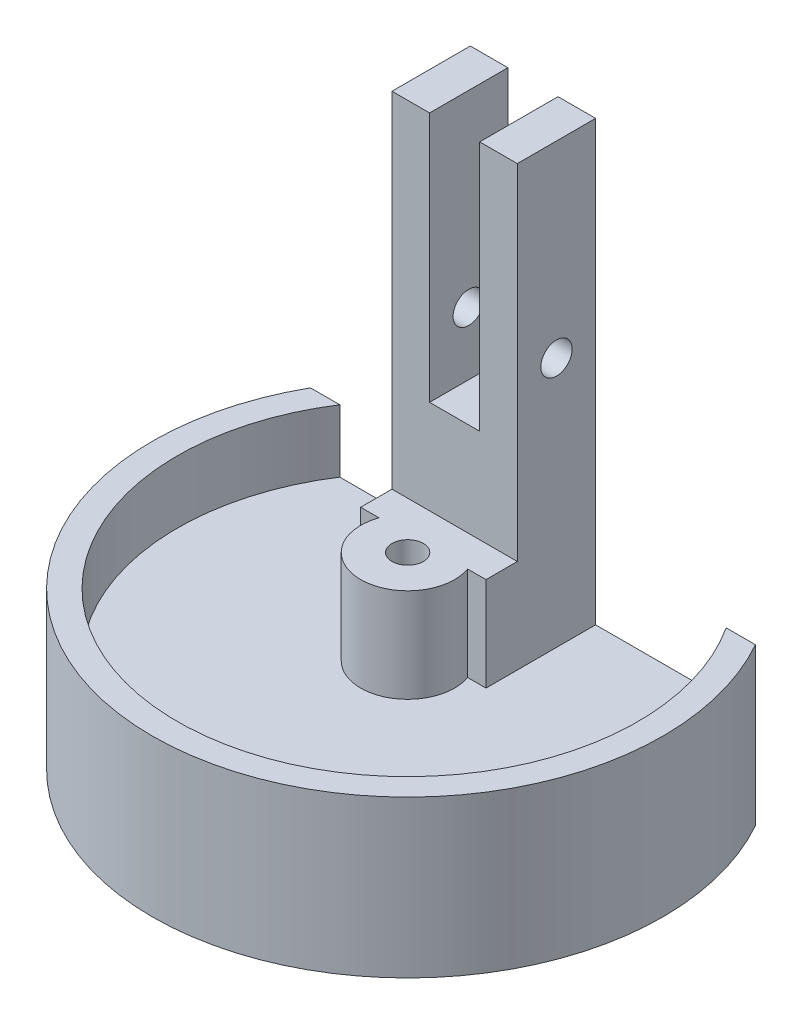
ISO-10303-21;
HEADER;
FILE_DESCRIPTION(('STEP AP214'),'2;1');
FILE_NAME('part.step','',(''),(''),'','','');
FILE_SCHEMA(('AUTOMOTIVE_DESIGN { 1 0 10303 214 1 1 1 1 }'));
ENDSEC;
DATA;
#1=APPLICATION_CONTEXT('core data for automotive mechanical design processes');
#2=APPLICATION_PROTOCOL_DEFINITION('international standard','automotive_design',2000,#1);
#3=PRODUCT_CONTEXT('',#1,'mechanical');
#4=PRODUCT('Part','Part','',(#3));
#5=PRODUCT_RELATED_PRODUCT_CATEGORY('part','',(#4));
#6=PRODUCT_DEFINITION_FORMATION('','',#4);
#7=PRODUCT_DEFINITION_CONTEXT('part definition',#1,'design');
#8=PRODUCT_DEFINITION('design','',#6,#7);
#9=PRODUCT_DEFINITION_SHAPE('','',#8);
#10=(LENGTH_UNIT() NAMED_UNIT(*) SI_UNIT(.MILLI.,.METRE.));
#11=(NAMED_UNIT(*) PLANE_ANGLE_UNIT() SI_UNIT($,.RADIAN.));
#12=(NAMED_UNIT(*) SI_UNIT($,.STERADIAN.) SOLID_ANGLE_UNIT());
#13=UNCERTAINTY_MEASURE_WITH_UNIT(LENGTH_MEASURE(1.E-05),#10,'distance_accuracy_value','');
#14=(GEOMETRIC_REPRESENTATION_CONTEXT(3) GLOBAL_UNCERTAINTY_ASSIGNED_CONTEXT((#13)) GLOBAL_UNIT_ASSIGNED_CONTEXT((#10,
#11,#12)) REPRESENTATION_CONTEXT('',''));
#15=CARTESIAN_POINT('',(0.,0.,0.));
#16=DIRECTION('',(0.,0.,1.));
#17=DIRECTION('',(1.,0.,0.));
#18=AXIS2_PLACEMENT_3D('',#15,#16,#17);
#19=CARTESIAN_POINT('',(-10.,75.,-2.5));
#20=DIRECTION('',(0.,0.,-1.));
#21=DIRECTION('',(-1.,0.,0.));
#22=AXIS2_PLACEMENT_3D('',#19,#20,#21);
#23=PLANE('',#22);
#24=DIRECTION('',(-1.,0.,0.));
#25=VECTOR('',#24,1.);
#26=CARTESIAN_POINT('',(-10.,20.,-2.5));
#27=LINE('',#26,#25);
#28=CARTESIAN_POINT('',(-7.07106781186547,20.,-2.5));
#29=VERTEX_POINT('',#28);
#30=CARTESIAN_POINT('',(-10.,20.,-2.5));
#31=VERTEX_POINT('',#30);
#32=EDGE_CURVE('E326',#29,#31,#27,.T.);
#33=ORIENTED_EDGE('',*,*,#32,.T.);
#34=DIRECTION('',(0.,-1.,0.));
#35=VECTOR('',#34,1.);
#36=CARTESIAN_POINT('',(-10.,75.,-2.5));
#37=LINE('',#36,#35);
#38=CARTESIAN_POINT('',(-10.,5.,-2.5));
#39=VERTEX_POINT('',#38);
#40=EDGE_CURVE('E54',#31,#39,#37,.T.);
#41=ORIENTED_EDGE('',*,*,#40,.T.);
#42=DIRECTION('',(1.,0.,0.));
#43=VECTOR('',#42,1.);
#44=CARTESIAN_POINT('',(-10.,5.,-2.5));
#45=LINE('',#44,#43);
#46=CARTESIAN_POINT('',(-7.07106781186547,5.,-2.5));
#47=VERTEX_POINT('',#46);
#48=EDGE_CURVE('E198',#39,#47,#45,.T.);
#49=ORIENTED_EDGE('',*,*,#48,.T.);
#50=DIRECTION('',(0.,-1.,0.));
#51=VECTOR('',#50,1.);
#52=CARTESIAN_POINT('',(-7.07106781186548,20.,-2.5));
#53=LINE('',#52,#51);
#54=EDGE_CURVE('E207',#47,#29,#53,.F.);
#55=ORIENTED_EDGE('',*,*,#54,.T.);
#56=EDGE_LOOP('',(#33,#41,#49,#55));
#57=FACE_BOUND('',#56,.T.);
#58=ADVANCED_FACE('F32',(#57),#23,.F.);
#59=CARTESIAN_POINT('',(10.,20.,-2.5));
#60=VERTEX_POINT('',#59);
#61=CARTESIAN_POINT('',(7.07106781186547,20.,-2.5));
#62=VERTEX_POINT('',#61);
#63=EDGE_CURVE('E323',#60,#62,#27,.T.);
#64=ORIENTED_EDGE('',*,*,#63,.T.);
#65=DIRECTION('',(0.,-1.,0.));
#66=VECTOR('',#65,1.);
#67=CARTESIAN_POINT('',(7.07106781186547,20.,-2.5));
#68=LINE('',#67,#66);
#69=CARTESIAN_POINT('',(7.07106781186547,5.,-2.5));
#70=VERTEX_POINT('',#69);
#71=EDGE_CURVE('E210',#62,#70,#68,.T.);
#72=ORIENTED_EDGE('',*,*,#71,.T.);
#73=CARTESIAN_POINT('',(10.,5.,-2.5));
#74=VERTEX_POINT('',#73);
#75=EDGE_CURVE('E196',#70,#74,#45,.T.);
#76=ORIENTED_EDGE('',*,*,#75,.T.);
#77=DIRECTION('',(0.,-1.,0.));
#78=VECTOR('',#77,1.);
#79=CARTESIAN_POINT('',(10.,75.,-2.5));
#80=LINE('',#79,#78);
#81=EDGE_CURVE('E204',#60,#74,#80,.T.);
#82=ORIENTED_EDGE('',*,*,#81,.F.);
#83=EDGE_LOOP('',(#64,#72,#76,#82));
#84=FACE_BOUND('',#83,.T.);
#85=ADVANCED_FACE('F341',(#84),#23,.F.);
#86=CARTESIAN_POINT('',(-10.,75.,-20.));
#87=DIRECTION('',(0.,-1.,0.));
#88=DIRECTION('',(0.,0.,-1.));
#89=AXIS2_PLACEMENT_3D('',#86,#87,#88);
#90=PLANE('',#89);
#91=DIRECTION('',(0.,0.,1.));
#92=VECTOR('',#91,1.);
#93=CARTESIAN_POINT('',(-10.,75.,-2.5));
#94=LINE('',#93,#92);
#95=CARTESIAN_POINT('',(-10.,75.,-20.));
#96=VERTEX_POINT('',#95);
#97=CARTESIAN_POINT('',(-10.,75.,-7.5));
#98=VERTEX_POINT('',#97);
#99=EDGE_CURVE('E183',#96,#98,#94,.T.);
#100=ORIENTED_EDGE('',*,*,#99,.T.);
#101=DIRECTION('',(-1.,0.,0.));
#102=VECTOR('',#101,1.);
#103=CARTESIAN_POINT('',(-10.,75.,-7.5));
#104=LINE('',#103,#102);
#105=CARTESIAN_POINT('',(-4.,75.,-7.5));
#106=VERTEX_POINT('',#105);
#107=EDGE_CURVE('E175',#106,#98,#104,.T.);
#108=ORIENTED_EDGE('',*,*,#107,.F.);
#109=DIRECTION('',(0.,0.,1.));
#110=VECTOR('',#109,1.);
#111=CARTESIAN_POINT('',(-4.,75.,-20.));
#112=LINE('',#111,#110);
#113=CARTESIAN_POINT('',(-4.,75.,-20.));
#114=VERTEX_POINT('',#113);
#115=EDGE_CURVE('E300',#114,#106,#112,.T.);
#116=ORIENTED_EDGE('',*,*,#115,.F.);
#117=DIRECTION('',(-1.,0.,0.));
#118=VECTOR('',#117,1.);
#119=CARTESIAN_POINT('',(-10.,75.,-20.));
#120=LINE('',#119,#118);
#121=EDGE_CURVE('E182',#114,#96,#120,.T.);
#122=ORIENTED_EDGE('',*,*,#121,.T.);
#123=EDGE_LOOP('',(#100,#108,#116,#122));
#124=FACE_BOUND('',#123,.T.);
#125=ADVANCED_FACE('F376',(#124),#90,.F.);
#126=CARTESIAN_POINT('',(0.,5.,0.));
#127=DIRECTION('',(0.,1.,0.));
#128=DIRECTION('',(0.,0.,1.));
#129=AXIS2_PLACEMENT_3D('',#126,#127,#128);
#130=PLANE('',#129);
#131=DIRECTION('',(1.,0.,0.));
#132=VECTOR('',#131,1.);
#133=CARTESIAN_POINT('',(-35.5044011356339,5.,-20.));
#134=LINE('',#133,#132);
#135=CARTESIAN_POINT('',(-30.8311936194498,5.,-20.));
#136=VERTEX_POINT('',#135);
#137=CARTESIAN_POINT('',(-10.,5.,-20.));
#138=VERTEX_POINT('',#137);
#139=EDGE_CURVE('E263',#136,#138,#134,.T.);
#140=ORIENTED_EDGE('',*,*,#139,.F.);
#141=CARTESIAN_POINT('',(0.,5.,0.));
#142=DIRECTION('',(0.,1.,0.));
#143=DIRECTION('',(0.,0.,1.));
#144=AXIS2_PLACEMENT_3D('',#141,#142,#143);
#145=CIRCLE('',#144,36.75);
#146=CARTESIAN_POINT('',(30.8311936194498,5.,-20.));
#147=VERTEX_POINT('',#146);
#148=EDGE_CURVE('E225',#136,#147,#145,.T.);
#149=ORIENTED_EDGE('',*,*,#148,.T.);
#150=CARTESIAN_POINT('',(9.99999999999999,5.,-20.));
#151=VERTEX_POINT('',#150);
#152=EDGE_CURVE('E260',#151,#147,#134,.T.);
#153=ORIENTED_EDGE('',*,*,#152,.F.);
#154=DIRECTION('',(0.,0.,-1.));
#155=VECTOR('',#154,1.);
#156=CARTESIAN_POINT('',(10.,5.,-2.5));
#157=LINE('',#156,#155);
#158=EDGE_CURVE('E188',#74,#151,#157,.T.);
#159=ORIENTED_EDGE('',*,*,#158,.F.);
#160=ORIENTED_EDGE('',*,*,#75,.F.);
#161=CARTESIAN_POINT('',(0.,5.,0.));
#162=DIRECTION('',(0.,1.,0.));
#163=DIRECTION('',(0.,0.,1.));
#164=AXIS2_PLACEMENT_3D('',#161,#162,#163);
#165=CIRCLE('',#164,7.5);
#166=EDGE_CURVE('E226',#47,#70,#165,.T.);
#167=ORIENTED_EDGE('',*,*,#166,.F.);
#168=ORIENTED_EDGE('',*,*,#48,.F.);
#169=DIRECTION('',(0.,0.,1.));
#170=VECTOR('',#169,1.);
#171=CARTESIAN_POINT('',(-10.,5.,-2.5));
#172=LINE('',#171,#170);
#173=EDGE_CURVE('E193',#138,#39,#172,.T.);
#174=ORIENTED_EDGE('',*,*,#173,.F.);
#175=EDGE_LOOP('',(#140,#149,#153,#159,#160,#167,#168,#174));
#176=FACE_BOUND('',#175,.T.);
#177=ADVANCED_FACE('F346',(#176),#130,.T.);
#178=CARTESIAN_POINT('',(0.,20.,0.));
#179=DIRECTION('',(0.,1.,0.));
#180=DIRECTION('',(0.,0.,1.));
#181=AXIS2_PLACEMENT_3D('',#178,#179,#180);
#182=PLANE('',#181);
#183=ORIENTED_EDGE('',*,*,#32,.F.);
#184=CARTESIAN_POINT('',(0.,20.,0.));
#185=DIRECTION('',(0.,1.,0.));
#186=DIRECTION('',(0.,0.,1.));
#187=AXIS2_PLACEMENT_3D('',#184,#185,#186);
#188=CIRCLE('',#187,7.5);
#189=EDGE_CURVE('E233',#29,#62,#188,.T.);
#190=ORIENTED_EDGE('',*,*,#189,.T.);
#191=ORIENTED_EDGE('',*,*,#63,.F.);
#192=DIRECTION('',(0.,0.,1.));
#193=VECTOR('',#192,1.);
#194=CARTESIAN_POINT('',(10.,20.,-2.5));
#195=LINE('',#194,#193);
#196=CARTESIAN_POINT('',(10.,20.,-7.5));
#197=VERTEX_POINT('',#196);
#198=EDGE_CURVE('E330',#197,#60,#195,.T.);
#199=ORIENTED_EDGE('',*,*,#198,.F.);
#200=DIRECTION('',(1.,0.,0.));
#201=VECTOR('',#200,1.);
#202=CARTESIAN_POINT('',(-10.,20.,-7.5));
#203=LINE('',#202,#201);
#204=CARTESIAN_POINT('',(-10.,20.,-7.5));
#205=VERTEX_POINT('',#204);
#206=EDGE_CURVE('E161',#205,#197,#203,.T.);
#207=ORIENTED_EDGE('',*,*,#206,.F.);
#208=DIRECTION('',(0.,0.,-1.));
#209=VECTOR('',#208,1.);
#210=CARTESIAN_POINT('',(-10.,20.,-2.5));
#211=LINE('',#210,#209);
#212=EDGE_CURVE('E332',#31,#205,#211,.T.);
#213=ORIENTED_EDGE('',*,*,#212,.F.);
#214=EDGE_LOOP('',(#183,#190,#191,#199,#207,#213));
#215=FACE_BOUND('',#214,.T.);
#216=CARTESIAN_POINT('',(0.,20.,0.));
#217=DIRECTION('',(0.,1.,0.));
#218=DIRECTION('',(0.,0.,1.));
#219=AXIS2_PLACEMENT_3D('',#216,#217,#218);
#220=CIRCLE('',#219,2.5);
#221=CARTESIAN_POINT('',(0.,20.,2.5));
#222=VERTEX_POINT('',#221);
#223=EDGE_CURVE('E230',#222,#222,#220,.T.);
#224=ORIENTED_EDGE('',*,*,#223,.F.);
#225=EDGE_LOOP('',(#224));
#226=FACE_BOUND('',#225,.T.);
#227=ADVANCED_FACE('F404',(#215,#226),#182,.T.);
#228=CARTESIAN_POINT('',(0.,20.,0.));
#229=DIRECTION('',(0.,-1.,0.));
#230=DIRECTION('',(0.,0.,-1.));
#231=AXIS2_PLACEMENT_3D('',#228,#229,#230);
#232=CYLINDRICAL_SURFACE('',#231,7.5);
#233=ORIENTED_EDGE('',*,*,#71,.F.);
#234=ORIENTED_EDGE('',*,*,#189,.F.);
#235=ORIENTED_EDGE('',*,*,#54,.F.);
#236=ORIENTED_EDGE('',*,*,#166,.T.);
#237=EDGE_LOOP('',(#233,#234,#235,#236));
#238=FACE_BOUND('',#237,.T.);
#239=ADVANCED_FACE('F34',(#238),#232,.T.);
#240=CARTESIAN_POINT('',(0.,0.,0.));
#241=DIRECTION('',(0.,1.,0.));
#242=DIRECTION('',(0.,0.,1.));
#243=AXIS2_PLACEMENT_3D('',#240,#241,#242);
#244=PLANE('',#243);
#245=CARTESIAN_POINT('',(0.,0.,0.));
#246=DIRECTION('',(0.,1.,0.));
#247=DIRECTION('',(0.,0.,1.));
#248=AXIS2_PLACEMENT_3D('',#245,#246,#247);
#249=CIRCLE('',#248,2.5);
#250=CARTESIAN_POINT('',(0.,0.,2.5));
#251=VERTEX_POINT('',#250);
#252=EDGE_CURVE('E229',#251,#251,#249,.T.);
#253=ORIENTED_EDGE('',*,*,#252,.T.);
#254=EDGE_LOOP('',(#253));
#255=FACE_BOUND('',#254,.T.);
#256=CARTESIAN_POINT('',(0.,0.,0.));
#257=DIRECTION('',(0.,1.,0.));
#258=DIRECTION('',(0.,0.,1.));
#259=AXIS2_PLACEMENT_3D('',#256,#257,#258);
#260=CIRCLE('',#259,36.75);
#261=CARTESIAN_POINT('',(-30.8311936194498,0.,-20.));
#262=VERTEX_POINT('',#261);
#263=CARTESIAN_POINT('',(30.8311936194498,0.,-20.));
#264=VERTEX_POINT('',#263);
#265=EDGE_CURVE('E40',#262,#264,#260,.T.);
#266=ORIENTED_EDGE('',*,*,#265,.F.);
#267=DIRECTION('',(1.,0.,0.));
#268=VECTOR('',#267,1.);
#269=CARTESIAN_POINT('',(-35.5044011356339,0.,-20.));
#270=LINE('',#269,#268);
#271=EDGE_CURVE('E258',#262,#264,#270,.T.);
#272=ORIENTED_EDGE('',*,*,#271,.T.);
#273=EDGE_LOOP('',(#266,#272));
#274=FACE_BOUND('',#273,.T.);
#275=ADVANCED_FACE('F257',(#255,#274),#244,.F.);
#276=CARTESIAN_POINT('',(0.,20.,0.));
#277=DIRECTION('',(0.,-1.,0.));
#278=DIRECTION('',(0.,0.,-1.));
#279=AXIS2_PLACEMENT_3D('',#276,#277,#278);
#280=CYLINDRICAL_SURFACE('',#279,2.5);
#281=ORIENTED_EDGE('',*,*,#223,.T.);
#282=EDGE_LOOP('',(#281));
#283=FACE_BOUND('',#282,.T.);
#284=ORIENTED_EDGE('',*,*,#252,.F.);
#285=EDGE_LOOP('',(#284));
#286=FACE_BOUND('',#285,.T.);
#287=ADVANCED_FACE('F365',(#283,#286),#280,.F.);
#288=CARTESIAN_POINT('',(0.,15.,0.));
#289=DIRECTION('',(0.,1.,0.));
#290=DIRECTION('',(0.,0.,1.));
#291=AXIS2_PLACEMENT_3D('',#288,#289,#290);
#292=PLANE('',#291);
#293=DIRECTION('',(1.,0.,0.));
#294=VECTOR('',#293,1.);
#295=CARTESIAN_POINT('',(-35.5044011356339,15.,-20.));
#296=LINE('',#295,#294);
#297=CARTESIAN_POINT('',(-35.5044011356339,15.,-20.));
#298=VERTEX_POINT('',#297);
#299=CARTESIAN_POINT('',(-30.8311936194498,15.,-20.));
#300=VERTEX_POINT('',#299);
#301=EDGE_CURVE('E261',#298,#300,#296,.T.);
#302=ORIENTED_EDGE('',*,*,#301,.F.);
#303=CARTESIAN_POINT('',(0.,15.,0.));
#304=DIRECTION('',(0.,1.,0.));
#305=DIRECTION('',(0.,0.,1.));
#306=AXIS2_PLACEMENT_3D('',#303,#304,#305);
#307=CIRCLE('',#306,40.75);
#308=CARTESIAN_POINT('',(35.5044011356339,15.,-20.));
#309=VERTEX_POINT('',#308);
#310=EDGE_CURVE('E216',#298,#309,#307,.T.);
#311=ORIENTED_EDGE('',*,*,#310,.T.);
#312=CARTESIAN_POINT('',(30.8311936194498,15.,-20.));
#313=VERTEX_POINT('',#312);
#314=EDGE_CURVE('E265',#313,#309,#296,.T.);
#315=ORIENTED_EDGE('',*,*,#314,.F.);
#316=CARTESIAN_POINT('',(0.,15.,0.));
#317=DIRECTION('',(0.,1.,0.));
#318=DIRECTION('',(0.,0.,1.));
#319=AXIS2_PLACEMENT_3D('',#316,#317,#318);
#320=CIRCLE('',#319,36.75);
#321=EDGE_CURVE('E213',#300,#313,#320,.T.);
#322=ORIENTED_EDGE('',*,*,#321,.F.);
#323=EDGE_LOOP('',(#302,#311,#315,#322));
#324=FACE_BOUND('',#323,.T.);
#325=ADVANCED_FACE('F357',(#324),#292,.T.);
#326=CARTESIAN_POINT('',(0.,-10.,0.));
#327=DIRECTION('',(0.,1.,0.));
#328=DIRECTION('',(0.,0.,1.));
#329=AXIS2_PLACEMENT_3D('',#326,#327,#328);
#330=CYLINDRICAL_SURFACE('',#329,36.75);
#331=ORIENTED_EDGE('',*,*,#321,.T.);
#332=DIRECTION('',(0.,1.,0.));
#333=VECTOR('',#332,1.);
#334=CARTESIAN_POINT('',(30.8311936194498,-10.,-20.));
#335=LINE('',#334,#333);
#336=EDGE_CURVE('E276',#313,#147,#335,.F.);
#337=ORIENTED_EDGE('',*,*,#336,.T.);
#338=ORIENTED_EDGE('',*,*,#148,.F.);
#339=DIRECTION('',(0.,1.,0.));
#340=VECTOR('',#339,1.);
#341=CARTESIAN_POINT('',(-30.8311936194498,-10.,-20.));
#342=LINE('',#341,#340);
#343=EDGE_CURVE('E270',#136,#300,#342,.T.);
#344=ORIENTED_EDGE('',*,*,#343,.T.);
#345=EDGE_LOOP('',(#331,#337,#338,#344));
#346=FACE_BOUND('',#345,.T.);
#347=ADVANCED_FACE('F354',(#346),#330,.F.);
#348=CARTESIAN_POINT('',(0.,5.,0.));
#349=DIRECTION('',(0.,-1.,0.));
#350=DIRECTION('',(0.,0.,-1.));
#351=AXIS2_PLACEMENT_3D('',#348,#349,#350);
#352=CYLINDRICAL_SURFACE('',#351,40.75);
#353=ORIENTED_EDGE('',*,*,#310,.F.);
#354=DIRECTION('',(0.,-1.,0.));
#355=VECTOR('',#354,1.);
#356=CARTESIAN_POINT('',(-35.5044011356339,5.,-20.));
#357=LINE('',#356,#355);
#358=CARTESIAN_POINT('',(-35.5044011356339,-10.,-20.));
#359=VERTEX_POINT('',#358);
#360=EDGE_CURVE('E586',#359,#298,#357,.F.);
#361=ORIENTED_EDGE('',*,*,#360,.F.);
#362=CARTESIAN_POINT('',(0.,-10.,0.));
#363=DIRECTION('',(0.,1.,0.));
#364=DIRECTION('',(0.,0.,1.));
#365=AXIS2_PLACEMENT_3D('',#362,#363,#364);
#366=CIRCLE('',#365,40.75);
#367=CARTESIAN_POINT('',(35.5044011356339,-10.,-20.));
#368=VERTEX_POINT('',#367);
#369=EDGE_CURVE('E222',#359,#368,#366,.T.);
#370=ORIENTED_EDGE('',*,*,#369,.T.);
#371=DIRECTION('',(0.,-1.,0.));
#372=VECTOR('',#371,1.);
#373=CARTESIAN_POINT('',(35.5044011356339,5.,-20.));
#374=LINE('',#373,#372);
#375=EDGE_CURVE('E272',#309,#368,#374,.T.);
#376=ORIENTED_EDGE('',*,*,#375,.F.);
#377=EDGE_LOOP('',(#353,#361,#370,#376));
#378=FACE_BOUND('',#377,.T.);
#379=ADVANCED_FACE('F356',(#378),#352,.T.);
#380=ORIENTED_EDGE('',*,*,#265,.T.);
#381=DIRECTION('',(0.,1.,0.));
#382=VECTOR('',#381,1.);
#383=CARTESIAN_POINT('',(30.8311936194498,-10.,-20.));
#384=LINE('',#383,#382);
#385=CARTESIAN_POINT('',(30.8311936194498,-10.,-20.));
#386=VERTEX_POINT('',#385);
#387=EDGE_CURVE('E253',#386,#264,#384,.T.);
#388=ORIENTED_EDGE('',*,*,#387,.F.);
#389=CARTESIAN_POINT('',(0.,-10.,0.));
#390=DIRECTION('',(0.,1.,0.));
#391=DIRECTION('',(0.,0.,1.));
#392=AXIS2_PLACEMENT_3D('',#389,#390,#391);
#393=CIRCLE('',#392,36.75);
#394=CARTESIAN_POINT('',(-30.8311936194498,-10.,-20.));
#395=VERTEX_POINT('',#394);
#396=EDGE_CURVE('E219',#395,#386,#393,.T.);
#397=ORIENTED_EDGE('',*,*,#396,.F.);
#398=DIRECTION('',(0.,1.,0.));
#399=VECTOR('',#398,1.);
#400=CARTESIAN_POINT('',(-30.8311936194498,-10.,-20.));
#401=LINE('',#400,#399);
#402=EDGE_CURVE('E254',#262,#395,#401,.F.);
#403=ORIENTED_EDGE('',*,*,#402,.F.);
#404=EDGE_LOOP('',(#380,#388,#397,#403));
#405=FACE_BOUND('',#404,.T.);
#406=ADVANCED_FACE('F251',(#405),#330,.F.);
#407=CARTESIAN_POINT('',(0.,-10.,0.));
#408=DIRECTION('',(0.,1.,0.));
#409=DIRECTION('',(0.,0.,1.));
#410=AXIS2_PLACEMENT_3D('',#407,#408,#409);
#411=PLANE('',#410);
#412=ORIENTED_EDGE('',*,*,#369,.F.);
#413=DIRECTION('',(-1.,0.,0.));
#414=VECTOR('',#413,1.);
#415=CARTESIAN_POINT('',(-35.5044011356339,-10.,-20.));
#416=LINE('',#415,#414);
#417=EDGE_CURVE('E287',#395,#359,#416,.T.);
#418=ORIENTED_EDGE('',*,*,#417,.F.);
#419=ORIENTED_EDGE('',*,*,#396,.T.);
#420=EDGE_CURVE('E295',#368,#386,#416,.T.);
#421=ORIENTED_EDGE('',*,*,#420,.F.);
#422=EDGE_LOOP('',(#412,#418,#419,#421));
#423=FACE_BOUND('',#422,.T.);
#424=ADVANCED_FACE('F370',(#423),#411,.F.);
#425=CARTESIAN_POINT('',(-10.,75.,-2.5));
#426=DIRECTION('',(1.,0.,0.));
#427=DIRECTION('',(0.,0.,-1.));
#428=AXIS2_PLACEMENT_3D('',#425,#426,#427);
#429=PLANE('',#428);
#430=CARTESIAN_POINT('',(-10.,45.,-13.75));
#431=DIRECTION('',(1.,0.,0.));
#432=DIRECTION('',(0.,0.,-1.));
#433=AXIS2_PLACEMENT_3D('',#430,#431,#432);
#434=CIRCLE('',#433,2.5);
#435=CARTESIAN_POINT('',(-10.,45.,-16.25));
#436=VERTEX_POINT('',#435);
#437=EDGE_CURVE('E244',#436,#436,#434,.F.);
#438=ORIENTED_EDGE('',*,*,#437,.F.);
#439=EDGE_LOOP('',(#438));
#440=FACE_BOUND('',#439,.T.);
#441=ORIENTED_EDGE('',*,*,#212,.T.);
#442=DIRECTION('',(0.,1.,0.));
#443=VECTOR('',#442,1.);
#444=CARTESIAN_POINT('',(-10.,-0.615528128088308,-7.5));
#445=LINE('',#444,#443);
#446=EDGE_CURVE('E166',#205,#98,#445,.T.);
#447=ORIENTED_EDGE('',*,*,#446,.T.);
#448=ORIENTED_EDGE('',*,*,#99,.F.);
#449=DIRECTION('',(0.,-1.,0.));
#450=VECTOR('',#449,1.);
#451=CARTESIAN_POINT('',(-10.,75.,-20.));
#452=LINE('',#451,#450);
#453=EDGE_CURVE('E192',#96,#138,#452,.T.);
#454=ORIENTED_EDGE('',*,*,#453,.T.);
#455=ORIENTED_EDGE('',*,*,#173,.T.);
#456=ORIENTED_EDGE('',*,*,#40,.F.);
#457=EDGE_LOOP('',(#441,#447,#448,#454,#455,#456));
#458=FACE_BOUND('',#457,.T.);
#459=ADVANCED_FACE('F351',(#440,#458),#429,.F.);
#460=CARTESIAN_POINT('',(10.,75.,-2.5));
#461=DIRECTION('',(-1.,0.,0.));
#462=DIRECTION('',(0.,0.,1.));
#463=AXIS2_PLACEMENT_3D('',#460,#461,#462);
#464=PLANE('',#463);
#465=CARTESIAN_POINT('',(10.,45.,-13.75));
#466=DIRECTION('',(1.,0.,0.));
#467=DIRECTION('',(0.,0.,-1.));
#468=AXIS2_PLACEMENT_3D('',#465,#466,#467);
#469=CIRCLE('',#468,2.5);
#470=CARTESIAN_POINT('',(10.,45.,-16.25));
#471=VERTEX_POINT('',#470);
#472=EDGE_CURVE('E292',#471,#471,#469,.T.);
#473=ORIENTED_EDGE('',*,*,#472,.F.);
#474=EDGE_LOOP('',(#473));
#475=FACE_BOUND('',#474,.T.);
#476=DIRECTION('',(0.,0.,-1.));
#477=VECTOR('',#476,1.);
#478=CARTESIAN_POINT('',(10.,75.,-2.5));
#479=LINE('',#478,#477);
#480=CARTESIAN_POINT('',(10.,75.,-7.5));
#481=VERTEX_POINT('',#480);
#482=CARTESIAN_POINT('',(10.,75.,-20.));
#483=VERTEX_POINT('',#482);
#484=EDGE_CURVE('E172',#481,#483,#479,.T.);
#485=ORIENTED_EDGE('',*,*,#484,.F.);
#486=DIRECTION('',(0.,1.,0.));
#487=VECTOR('',#486,1.);
#488=CARTESIAN_POINT('',(10.,-0.615528128088308,-7.5));
#489=LINE('',#488,#487);
#490=EDGE_CURVE('E156',#197,#481,#489,.T.);
#491=ORIENTED_EDGE('',*,*,#490,.F.);
#492=ORIENTED_EDGE('',*,*,#198,.T.);
#493=ORIENTED_EDGE('',*,*,#81,.T.);
#494=ORIENTED_EDGE('',*,*,#158,.T.);
#495=DIRECTION('',(0.,-1.,0.));
#496=VECTOR('',#495,1.);
#497=CARTESIAN_POINT('',(10.,75.,-20.));
#498=LINE('',#497,#496);
#499=EDGE_CURVE('E180',#483,#151,#498,.T.);
#500=ORIENTED_EDGE('',*,*,#499,.F.);
#501=EDGE_LOOP('',(#485,#491,#492,#493,#494,#500));
#502=FACE_BOUND('',#501,.T.);
#503=ADVANCED_FACE('F177',(#475,#502),#464,.F.);
#504=CARTESIAN_POINT('',(-10.,75.,-20.));
#505=DIRECTION('',(0.,0.,1.));
#506=DIRECTION('',(1.,0.,0.));
#507=AXIS2_PLACEMENT_3D('',#504,#505,#506);
#508=PLANE('',#507);
#509=ORIENTED_EDGE('',*,*,#121,.F.);
#510=DIRECTION('',(0.,1.,0.));
#511=VECTOR('',#510,1.);
#512=CARTESIAN_POINT('',(-4.,35.,-20.));
#513=LINE('',#512,#511);
#514=CARTESIAN_POINT('',(-4.,35.,-20.));
#515=VERTEX_POINT('',#514);
#516=EDGE_CURVE('E197',#515,#114,#513,.T.);
#517=ORIENTED_EDGE('',*,*,#516,.F.);
#518=DIRECTION('',(-1.,0.,0.));
#519=VECTOR('',#518,1.);
#520=CARTESIAN_POINT('',(-4.,35.,-20.));
#521=LINE('',#520,#519);
#522=CARTESIAN_POINT('',(4.,35.,-20.));
#523=VERTEX_POINT('',#522);
#524=EDGE_CURVE('E306',#523,#515,#521,.T.);
#525=ORIENTED_EDGE('',*,*,#524,.F.);
#526=DIRECTION('',(0.,1.,0.));
#527=VECTOR('',#526,1.);
#528=CARTESIAN_POINT('',(4.,35.,-20.));
#529=LINE('',#528,#527);
#530=CARTESIAN_POINT('',(4.,75.,-20.));
#531=VERTEX_POINT('',#530);
#532=EDGE_CURVE('E309',#523,#531,#529,.T.);
#533=ORIENTED_EDGE('',*,*,#532,.T.);
#534=EDGE_CURVE('E185',#483,#531,#120,.T.);
#535=ORIENTED_EDGE('',*,*,#534,.F.);
#536=ORIENTED_EDGE('',*,*,#499,.T.);
#537=ORIENTED_EDGE('',*,*,#152,.T.);
#538=ORIENTED_EDGE('',*,*,#336,.F.);
#539=ORIENTED_EDGE('',*,*,#314,.T.);
#540=ORIENTED_EDGE('',*,*,#375,.T.);
#541=ORIENTED_EDGE('',*,*,#420,.T.);
#542=ORIENTED_EDGE('',*,*,#387,.T.);
#543=ORIENTED_EDGE('',*,*,#271,.F.);
#544=ORIENTED_EDGE('',*,*,#402,.T.);
#545=ORIENTED_EDGE('',*,*,#417,.T.);
#546=ORIENTED_EDGE('',*,*,#360,.T.);
#547=ORIENTED_EDGE('',*,*,#301,.T.);
#548=ORIENTED_EDGE('',*,*,#343,.F.);
#549=ORIENTED_EDGE('',*,*,#139,.T.);
#550=ORIENTED_EDGE('',*,*,#453,.F.);
#551=EDGE_LOOP('',(#509,#517,#525,#533,#535,#536,#537,#538,#539,#540,#541,#542,#543,#544,#545,
#546,#547,#548,#549,#550));
#552=FACE_BOUND('',#551,.T.);
#553=ADVANCED_FACE('F317',(#552),#508,.F.);
#554=DIRECTION('',(0.,0.,-1.));
#555=VECTOR('',#554,1.);
#556=CARTESIAN_POINT('',(4.,75.,-20.));
#557=LINE('',#556,#555);
#558=CARTESIAN_POINT('',(4.,75.,-7.5));
#559=VERTEX_POINT('',#558);
#560=EDGE_CURVE('E174',#559,#531,#557,.T.);
#561=ORIENTED_EDGE('',*,*,#560,.F.);
#562=EDGE_CURVE('E159',#481,#559,#104,.T.);
#563=ORIENTED_EDGE('',*,*,#562,.F.);
#564=ORIENTED_EDGE('',*,*,#484,.T.);
#565=ORIENTED_EDGE('',*,*,#534,.T.);
#566=EDGE_LOOP('',(#561,#563,#564,#565));
#567=FACE_BOUND('',#566,.T.);
#568=ADVANCED_FACE('F170',(#567),#90,.F.);
#569=CARTESIAN_POINT('',(-4.,35.,-20.));
#570=DIRECTION('',(-1.,0.,0.));
#571=DIRECTION('',(0.,0.,1.));
#572=AXIS2_PLACEMENT_3D('',#569,#570,#571);
#573=PLANE('',#572);
#574=CARTESIAN_POINT('',(-4.,45.,-13.75));
#575=DIRECTION('',(-1.,0.,0.));
#576=DIRECTION('',(0.,0.,1.));
#577=AXIS2_PLACEMENT_3D('',#574,#575,#576);
#578=CIRCLE('',#577,2.5);
#579=CARTESIAN_POINT('',(-4.,45.,-11.25));
#580=VERTEX_POINT('',#579);
#581=EDGE_CURVE('E243',#580,#580,#578,.T.);
#582=ORIENTED_EDGE('',*,*,#581,.T.);
#583=EDGE_LOOP('',(#582));
#584=FACE_BOUND('',#583,.T.);
#585=ORIENTED_EDGE('',*,*,#115,.T.);
#586=DIRECTION('',(0.,-1.,0.));
#587=VECTOR('',#586,1.);
#588=CARTESIAN_POINT('',(-4.,35.,-7.5));
#589=LINE('',#588,#587);
#590=CARTESIAN_POINT('',(-4.,35.,-7.5));
#591=VERTEX_POINT('',#590);
#592=EDGE_CURVE('E322',#106,#591,#589,.T.);
#593=ORIENTED_EDGE('',*,*,#592,.T.);
#594=DIRECTION('',(0.,0.,1.));
#595=VECTOR('',#594,1.);
#596=CARTESIAN_POINT('',(-4.,35.,-20.));
#597=LINE('',#596,#595);
#598=EDGE_CURVE('E301',#515,#591,#597,.T.);
#599=ORIENTED_EDGE('',*,*,#598,.F.);
#600=ORIENTED_EDGE('',*,*,#516,.T.);
#601=EDGE_LOOP('',(#585,#593,#599,#600));
#602=FACE_BOUND('',#601,.T.);
#603=ADVANCED_FACE('F397',(#584,#602),#573,.F.);
#604=CARTESIAN_POINT('',(4.,35.,-20.));
#605=DIRECTION('',(1.,0.,0.));
#606=DIRECTION('',(0.,0.,-1.));
#607=AXIS2_PLACEMENT_3D('',#604,#605,#606);
#608=PLANE('',#607);
#609=CARTESIAN_POINT('',(4.,45.,-13.75));
#610=DIRECTION('',(1.,0.,0.));
#611=DIRECTION('',(0.,0.,-1.));
#612=AXIS2_PLACEMENT_3D('',#609,#610,#611);
#613=CIRCLE('',#612,2.5);
#614=CARTESIAN_POINT('',(4.,45.,-16.25));
#615=VERTEX_POINT('',#614);
#616=EDGE_CURVE('E240',#615,#615,#613,.T.);
#617=ORIENTED_EDGE('',*,*,#616,.T.);
#618=EDGE_LOOP('',(#617));
#619=FACE_BOUND('',#618,.T.);
#620=DIRECTION('',(0.,0.,-1.));
#621=VECTOR('',#620,1.);
#622=CARTESIAN_POINT('',(4.,35.,-20.));
#623=LINE('',#622,#621);
#624=CARTESIAN_POINT('',(4.,35.,-7.5));
#625=VERTEX_POINT('',#624);
#626=EDGE_CURVE('E304',#625,#523,#623,.T.);
#627=ORIENTED_EDGE('',*,*,#626,.F.);
#628=DIRECTION('',(0.,1.,0.));
#629=VECTOR('',#628,1.);
#630=CARTESIAN_POINT('',(4.,35.,-7.5));
#631=LINE('',#630,#629);
#632=EDGE_CURVE('E46',#625,#559,#631,.T.);
#633=ORIENTED_EDGE('',*,*,#632,.T.);
#634=ORIENTED_EDGE('',*,*,#560,.T.);
#635=ORIENTED_EDGE('',*,*,#532,.F.);
#636=EDGE_LOOP('',(#627,#633,#634,#635));
#637=FACE_BOUND('',#636,.T.);
#638=ADVANCED_FACE('F321',(#619,#637),#608,.F.);
#639=CARTESIAN_POINT('',(-4.,35.,-2.5));
#640=DIRECTION('',(0.,1.,0.));
#641=DIRECTION('',(0.,0.,1.));
#642=AXIS2_PLACEMENT_3D('',#639,#640,#641);
#643=PLANE('',#642);
#644=DIRECTION('',(-1.,0.,0.));
#645=VECTOR('',#644,1.);
#646=CARTESIAN_POINT('',(-4.,35.,-7.5));
#647=LINE('',#646,#645);
#648=EDGE_CURVE('E12',#625,#591,#647,.T.);
#649=ORIENTED_EDGE('',*,*,#648,.F.);
#650=ORIENTED_EDGE('',*,*,#626,.T.);
#651=ORIENTED_EDGE('',*,*,#524,.T.);
#652=ORIENTED_EDGE('',*,*,#598,.T.);
#653=EDGE_LOOP('',(#649,#650,#651,#652));
#654=FACE_BOUND('',#653,.T.);
#655=ADVANCED_FACE('F462',(#654),#643,.T.);
#656=CARTESIAN_POINT('',(-17.0710678118655,45.,-13.75));
#657=DIRECTION('',(1.,0.,0.));
#658=DIRECTION('',(0.,0.,-1.));
#659=AXIS2_PLACEMENT_3D('',#656,#657,#658);
#660=CYLINDRICAL_SURFACE('',#659,2.5);
#661=ORIENTED_EDGE('',*,*,#472,.T.);
#662=EDGE_LOOP('',(#661));
#663=FACE_BOUND('',#662,.T.);
#664=ORIENTED_EDGE('',*,*,#616,.F.);
#665=EDGE_LOOP('',(#664));
#666=FACE_BOUND('',#665,.T.);
#667=ADVANCED_FACE('F393',(#663,#666),#660,.F.);
#668=ORIENTED_EDGE('',*,*,#437,.T.);
#669=EDGE_LOOP('',(#668));
#670=FACE_BOUND('',#669,.T.);
#671=ORIENTED_EDGE('',*,*,#581,.F.);
#672=EDGE_LOOP('',(#671));
#673=FACE_BOUND('',#672,.T.);
#674=ADVANCED_FACE('F390',(#670,#673),#660,.F.);
#675=CARTESIAN_POINT('',(-10.,-0.615528128088308,-7.5));
#676=DIRECTION('',(0.,0.,-1.));
#677=DIRECTION('',(-1.,0.,0.));
#678=AXIS2_PLACEMENT_3D('',#675,#676,#677);
#679=PLANE('',#678);
#680=ORIENTED_EDGE('',*,*,#107,.T.);
#681=ORIENTED_EDGE('',*,*,#446,.F.);
#682=ORIENTED_EDGE('',*,*,#206,.T.);
#683=ORIENTED_EDGE('',*,*,#490,.T.);
#684=ORIENTED_EDGE('',*,*,#562,.T.);
#685=ORIENTED_EDGE('',*,*,#632,.F.);
#686=ORIENTED_EDGE('',*,*,#648,.T.);
#687=ORIENTED_EDGE('',*,*,#592,.F.);
#688=EDGE_LOOP('',(#680,#681,#682,#683,#684,#685,#686,#687));
#689=FACE_BOUND('',#688,.T.);
#690=ADVANCED_FACE('F158',(#689),#679,.F.);
#691=CLOSED_SHELL('',(#58,#85,#125,#177,#227,#239,#275,#287,#325,#347,#379,#406,#424,#459,#503,
#553,#568,#603,#638,#655,#667,#674,#690));
#692=MANIFOLD_SOLID_BREP('B2',#691);
#693=ADVANCED_BREP_SHAPE_REPRESENTATION('',(#18,#692),#14);
#694=SHAPE_DEFINITION_REPRESENTATION(#9,#693);
ENDSEC;
END-ISO-10303-21;
